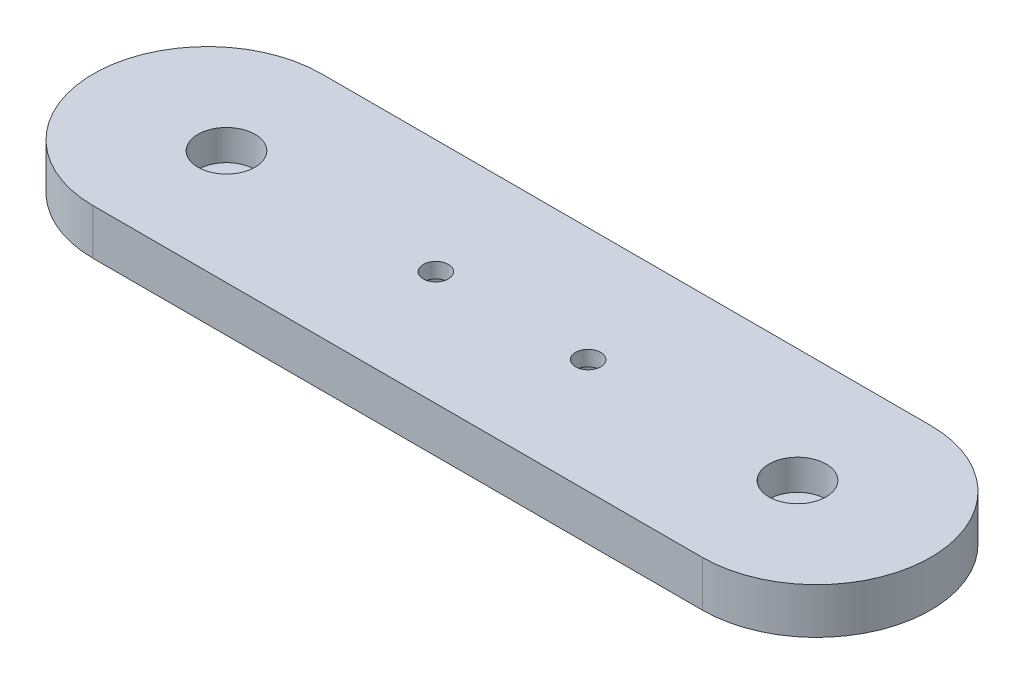
ISO-10303-21;
HEADER;
FILE_DESCRIPTION(('STEP AP214'),'2;1');
FILE_NAME('part.step','',(''),(''),'','','');
FILE_SCHEMA(('AUTOMOTIVE_DESIGN { 1 0 10303 214 1 1 1 1 }'));
ENDSEC;
DATA;
#1=APPLICATION_CONTEXT('core data for automotive mechanical design processes');
#2=APPLICATION_PROTOCOL_DEFINITION('international standard','automotive_design',2000,#1);
#3=PRODUCT_CONTEXT('',#1,'mechanical');
#4=PRODUCT('Part','Part','',(#3));
#5=PRODUCT_RELATED_PRODUCT_CATEGORY('part','',(#4));
#6=PRODUCT_DEFINITION_FORMATION('','',#4);
#7=PRODUCT_DEFINITION_CONTEXT('part definition',#1,'design');
#8=PRODUCT_DEFINITION('design','',#6,#7);
#9=PRODUCT_DEFINITION_SHAPE('','',#8);
#10=(LENGTH_UNIT() NAMED_UNIT(*) SI_UNIT(.MILLI.,.METRE.));
#11=(NAMED_UNIT(*) PLANE_ANGLE_UNIT() SI_UNIT($,.RADIAN.));
#12=(NAMED_UNIT(*) SI_UNIT($,.STERADIAN.) SOLID_ANGLE_UNIT());
#13=UNCERTAINTY_MEASURE_WITH_UNIT(LENGTH_MEASURE(1.E-05),#10,'distance_accuracy_value','');
#14=(GEOMETRIC_REPRESENTATION_CONTEXT(3) GLOBAL_UNCERTAINTY_ASSIGNED_CONTEXT((#13)) GLOBAL_UNIT_ASSIGNED_CONTEXT((#10,
#11,#12)) REPRESENTATION_CONTEXT('',''));
#15=CARTESIAN_POINT('',(0.,0.,0.));
#16=DIRECTION('',(0.,0.,1.));
#17=DIRECTION('',(1.,0.,0.));
#18=AXIS2_PLACEMENT_3D('',#15,#16,#17);
#19=CARTESIAN_POINT('',(10.,6.,0.));
#20=DIRECTION('',(0.,1.,0.));
#21=DIRECTION('',(0.,0.,1.));
#22=AXIS2_PLACEMENT_3D('',#19,#20,#21);
#23=CYLINDRICAL_SURFACE('',#22,1.64999999999999);
#24=CARTESIAN_POINT('',(10.,6.,0.));
#25=DIRECTION('',(0.,1.,0.));
#26=DIRECTION('',(0.,0.,1.));
#27=AXIS2_PLACEMENT_3D('',#24,#25,#26);
#28=CIRCLE('',#27,1.64999999999999);
#29=CARTESIAN_POINT('',(10.,6.,1.64999999999998));
#30=VERTEX_POINT('',#29);
#31=EDGE_CURVE('E114',#30,#30,#28,.T.);
#32=ORIENTED_EDGE('',*,*,#31,.T.);
#33=EDGE_LOOP('',(#32));
#34=FACE_BOUND('',#33,.T.);
#35=CARTESIAN_POINT('',(10.,4.,0.));
#36=DIRECTION('',(0.,-1.,0.));
#37=DIRECTION('',(0.,0.,-1.));
#38=AXIS2_PLACEMENT_3D('',#35,#36,#37);
#39=CIRCLE('',#38,1.64999999999999);
#40=CARTESIAN_POINT('',(10.,4.,-1.65));
#41=VERTEX_POINT('',#40);
#42=EDGE_CURVE('E40',#41,#41,#39,.F.);
#43=ORIENTED_EDGE('',*,*,#42,.F.);
#44=EDGE_LOOP('',(#43));
#45=FACE_BOUND('',#44,.T.);
#46=ADVANCED_FACE('F36',(#34,#45),#23,.F.);
#47=CARTESIAN_POINT('',(-10.,6.,0.));
#48=DIRECTION('',(0.,1.,0.));
#49=DIRECTION('',(0.,0.,1.));
#50=AXIS2_PLACEMENT_3D('',#47,#48,#49);
#51=CYLINDRICAL_SURFACE('',#50,1.64999999999999);
#52=CARTESIAN_POINT('',(-10.,6.,0.));
#53=DIRECTION('',(0.,1.,0.));
#54=DIRECTION('',(0.,0.,1.));
#55=AXIS2_PLACEMENT_3D('',#52,#53,#54);
#56=CIRCLE('',#55,1.64999999999999);
#57=CARTESIAN_POINT('',(-10.,6.,1.64999999999998));
#58=VERTEX_POINT('',#57);
#59=EDGE_CURVE('E121',#58,#58,#56,.T.);
#60=ORIENTED_EDGE('',*,*,#59,.T.);
#61=EDGE_LOOP('',(#60));
#62=FACE_BOUND('',#61,.T.);
#63=CARTESIAN_POINT('',(-10.,4.,0.));
#64=DIRECTION('',(0.,-1.,0.));
#65=DIRECTION('',(0.,0.,-1.));
#66=AXIS2_PLACEMENT_3D('',#63,#64,#65);
#67=CIRCLE('',#66,1.64999999999999);
#68=CARTESIAN_POINT('',(-10.,4.,-1.65));
#69=VERTEX_POINT('',#68);
#70=EDGE_CURVE('E122',#69,#69,#67,.F.);
#71=ORIENTED_EDGE('',*,*,#70,.F.);
#72=EDGE_LOOP('',(#71));
#73=FACE_BOUND('',#72,.T.);
#74=ADVANCED_FACE('F180',(#62,#73),#51,.F.);
#75=CARTESIAN_POINT('',(37.5,6.,0.));
#76=DIRECTION('',(0.,1.,0.));
#77=DIRECTION('',(0.,0.,1.));
#78=AXIS2_PLACEMENT_3D('',#75,#76,#77);
#79=CYLINDRICAL_SURFACE('',#78,1.65);
#80=CARTESIAN_POINT('',(37.5,0.,0.));
#81=DIRECTION('',(0.,-1.,0.));
#82=DIRECTION('',(0.,0.,-1.));
#83=AXIS2_PLACEMENT_3D('',#80,#81,#82);
#84=CIRCLE('',#83,1.65);
#85=CARTESIAN_POINT('',(37.5,0.,-1.65));
#86=VERTEX_POINT('',#85);
#87=EDGE_CURVE('E106',#86,#86,#84,.T.);
#88=ORIENTED_EDGE('',*,*,#87,.T.);
#89=EDGE_LOOP('',(#88));
#90=FACE_BOUND('',#89,.T.);
#91=CARTESIAN_POINT('',(37.5,2.,0.));
#92=DIRECTION('',(0.,1.,0.));
#93=DIRECTION('',(0.,0.,1.));
#94=AXIS2_PLACEMENT_3D('',#91,#92,#93);
#95=CIRCLE('',#94,1.65);
#96=CARTESIAN_POINT('',(37.5,2.,1.65));
#97=VERTEX_POINT('',#96);
#98=EDGE_CURVE('E118',#97,#97,#95,.F.);
#99=ORIENTED_EDGE('',*,*,#98,.F.);
#100=EDGE_LOOP('',(#99));
#101=FACE_BOUND('',#100,.T.);
#102=ADVANCED_FACE('F185',(#90,#101),#79,.F.);
#103=CARTESIAN_POINT('',(-37.5,6.,0.));
#104=DIRECTION('',(0.,1.,0.));
#105=DIRECTION('',(0.,0.,1.));
#106=AXIS2_PLACEMENT_3D('',#103,#104,#105);
#107=CYLINDRICAL_SURFACE('',#106,1.65);
#108=CARTESIAN_POINT('',(-37.5,0.,0.));
#109=DIRECTION('',(0.,-1.,0.));
#110=DIRECTION('',(0.,0.,-1.));
#111=AXIS2_PLACEMENT_3D('',#108,#109,#110);
#112=CIRCLE('',#111,1.65);
#113=CARTESIAN_POINT('',(-37.5,0.,-1.65));
#114=VERTEX_POINT('',#113);
#115=EDGE_CURVE('E155',#114,#114,#112,.T.);
#116=ORIENTED_EDGE('',*,*,#115,.T.);
#117=EDGE_LOOP('',(#116));
#118=FACE_BOUND('',#117,.T.);
#119=CARTESIAN_POINT('',(-37.5,2.,0.));
#120=DIRECTION('',(0.,1.,0.));
#121=DIRECTION('',(0.,0.,1.));
#122=AXIS2_PLACEMENT_3D('',#119,#120,#121);
#123=CIRCLE('',#122,1.65);
#124=CARTESIAN_POINT('',(-37.5,2.,1.65));
#125=VERTEX_POINT('',#124);
#126=EDGE_CURVE('E115',#125,#125,#123,.F.);
#127=ORIENTED_EDGE('',*,*,#126,.F.);
#128=EDGE_LOOP('',(#127));
#129=FACE_BOUND('',#128,.T.);
#130=ADVANCED_FACE('F189',(#118,#129),#107,.F.);
#131=CARTESIAN_POINT('',(40.,6.,0.));
#132=DIRECTION('',(0.,-1.,0.));
#133=DIRECTION('',(0.,0.,-1.));
#134=AXIS2_PLACEMENT_3D('',#131,#132,#133);
#135=CYLINDRICAL_SURFACE('',#134,15.);
#136=CARTESIAN_POINT('',(40.,0.,0.));
#137=DIRECTION('',(0.,1.,0.));
#138=DIRECTION('',(0.,0.,-1.));
#139=AXIS2_PLACEMENT_3D('',#136,#137,#138);
#140=CIRCLE('',#139,15.);
#141=CARTESIAN_POINT('',(40.,0.,15.));
#142=VERTEX_POINT('',#141);
#143=CARTESIAN_POINT('',(40.,0.,-15.));
#144=VERTEX_POINT('',#143);
#145=EDGE_CURVE('E103',#142,#144,#140,.T.);
#146=ORIENTED_EDGE('',*,*,#145,.T.);
#147=DIRECTION('',(0.,-1.,0.));
#148=VECTOR('',#147,1.);
#149=CARTESIAN_POINT('',(40.,6.,-15.));
#150=LINE('',#149,#148);
#151=CARTESIAN_POINT('',(40.,6.,-15.));
#152=VERTEX_POINT('',#151);
#153=EDGE_CURVE('E11',#152,#144,#150,.T.);
#154=ORIENTED_EDGE('',*,*,#153,.F.);
#155=CARTESIAN_POINT('',(40.,6.,0.));
#156=DIRECTION('',(0.,1.,0.));
#157=DIRECTION('',(0.,0.,-1.));
#158=AXIS2_PLACEMENT_3D('',#155,#156,#157);
#159=CIRCLE('',#158,15.);
#160=CARTESIAN_POINT('',(40.,6.,15.));
#161=VERTEX_POINT('',#160);
#162=EDGE_CURVE('E90',#161,#152,#159,.T.);
#163=ORIENTED_EDGE('',*,*,#162,.F.);
#164=DIRECTION('',(0.,-1.,0.));
#165=VECTOR('',#164,1.);
#166=CARTESIAN_POINT('',(40.,6.,15.));
#167=LINE('',#166,#165);
#168=EDGE_CURVE('E99',#161,#142,#167,.T.);
#169=ORIENTED_EDGE('',*,*,#168,.T.);
#170=EDGE_LOOP('',(#146,#154,#163,#169));
#171=FACE_BOUND('',#170,.T.);
#172=ADVANCED_FACE('F38',(#171),#135,.T.);
#173=CARTESIAN_POINT('',(-40.,6.,-15.));
#174=DIRECTION('',(0.,0.,1.));
#175=DIRECTION('',(1.,0.,0.));
#176=AXIS2_PLACEMENT_3D('',#173,#174,#175);
#177=PLANE('',#176);
#178=DIRECTION('',(-1.,0.,0.));
#179=VECTOR('',#178,1.);
#180=CARTESIAN_POINT('',(-40.,0.,-15.));
#181=LINE('',#180,#179);
#182=CARTESIAN_POINT('',(-40.,0.,-15.));
#183=VERTEX_POINT('',#182);
#184=EDGE_CURVE('E94',#144,#183,#181,.T.);
#185=ORIENTED_EDGE('',*,*,#184,.T.);
#186=DIRECTION('',(0.,-1.,0.));
#187=VECTOR('',#186,1.);
#188=CARTESIAN_POINT('',(-40.,6.,-15.));
#189=LINE('',#188,#187);
#190=CARTESIAN_POINT('',(-40.,6.,-15.));
#191=VERTEX_POINT('',#190);
#192=EDGE_CURVE('E46',#191,#183,#189,.T.);
#193=ORIENTED_EDGE('',*,*,#192,.F.);
#194=DIRECTION('',(-1.,0.,0.));
#195=VECTOR('',#194,1.);
#196=CARTESIAN_POINT('',(-40.,6.,-15.));
#197=LINE('',#196,#195);
#198=EDGE_CURVE('E85',#152,#191,#197,.T.);
#199=ORIENTED_EDGE('',*,*,#198,.F.);
#200=ORIENTED_EDGE('',*,*,#153,.T.);
#201=EDGE_LOOP('',(#185,#193,#199,#200));
#202=FACE_BOUND('',#201,.T.);
#203=ADVANCED_FACE('F93',(#202),#177,.F.);
#204=CARTESIAN_POINT('',(-40.,6.,0.));
#205=DIRECTION('',(0.,-1.,0.));
#206=DIRECTION('',(0.,0.,-1.));
#207=AXIS2_PLACEMENT_3D('',#204,#205,#206);
#208=CYLINDRICAL_SURFACE('',#207,15.);
#209=CARTESIAN_POINT('',(-40.,0.,0.));
#210=DIRECTION('',(0.,1.,0.));
#211=DIRECTION('',(0.,0.,-1.));
#212=AXIS2_PLACEMENT_3D('',#209,#210,#211);
#213=CIRCLE('',#212,15.);
#214=CARTESIAN_POINT('',(-40.,0.,15.));
#215=VERTEX_POINT('',#214);
#216=EDGE_CURVE('E72',#183,#215,#213,.T.);
#217=ORIENTED_EDGE('',*,*,#216,.T.);
#218=DIRECTION('',(0.,-1.,0.));
#219=VECTOR('',#218,1.);
#220=CARTESIAN_POINT('',(-40.,6.,15.));
#221=LINE('',#220,#219);
#222=CARTESIAN_POINT('',(-40.,6.,15.));
#223=VERTEX_POINT('',#222);
#224=EDGE_CURVE('E95',#223,#215,#221,.T.);
#225=ORIENTED_EDGE('',*,*,#224,.F.);
#226=CARTESIAN_POINT('',(-40.,6.,0.));
#227=DIRECTION('',(0.,1.,0.));
#228=DIRECTION('',(0.,0.,-1.));
#229=AXIS2_PLACEMENT_3D('',#226,#227,#228);
#230=CIRCLE('',#229,15.);
#231=EDGE_CURVE('E88',#191,#223,#230,.T.);
#232=ORIENTED_EDGE('',*,*,#231,.F.);
#233=ORIENTED_EDGE('',*,*,#192,.T.);
#234=EDGE_LOOP('',(#217,#225,#232,#233));
#235=FACE_BOUND('',#234,.T.);
#236=ADVANCED_FACE('F97',(#235),#208,.T.);
#237=CARTESIAN_POINT('',(-40.,6.,15.));
#238=DIRECTION('',(0.,0.,-1.));
#239=DIRECTION('',(-1.,0.,0.));
#240=AXIS2_PLACEMENT_3D('',#237,#238,#239);
#241=PLANE('',#240);
#242=DIRECTION('',(1.,0.,0.));
#243=VECTOR('',#242,1.);
#244=CARTESIAN_POINT('',(-40.,0.,15.));
#245=LINE('',#244,#243);
#246=EDGE_CURVE('E78',#215,#142,#245,.T.);
#247=ORIENTED_EDGE('',*,*,#246,.T.);
#248=ORIENTED_EDGE('',*,*,#168,.F.);
#249=DIRECTION('',(1.,0.,0.));
#250=VECTOR('',#249,1.);
#251=CARTESIAN_POINT('',(-40.,6.,15.));
#252=LINE('',#251,#250);
#253=EDGE_CURVE('E55',#223,#161,#252,.T.);
#254=ORIENTED_EDGE('',*,*,#253,.F.);
#255=ORIENTED_EDGE('',*,*,#224,.T.);
#256=EDGE_LOOP('',(#247,#248,#254,#255));
#257=FACE_BOUND('',#256,.T.);
#258=ADVANCED_FACE('F165',(#257),#241,.F.);
#259=CARTESIAN_POINT('',(40.,6.,0.));
#260=DIRECTION('',(0.,-1.,0.));
#261=DIRECTION('',(0.,0.,-1.));
#262=AXIS2_PLACEMENT_3D('',#259,#260,#261);
#263=PLANE('',#262);
#264=CARTESIAN_POINT('',(37.5,6.,0.));
#265=DIRECTION('',(0.,1.,0.));
#266=DIRECTION('',(0.,0.,1.));
#267=AXIS2_PLACEMENT_3D('',#264,#265,#266);
#268=CIRCLE('',#267,3.75000000000001);
#269=CARTESIAN_POINT('',(37.5,6.,3.75000000000001));
#270=VERTEX_POINT('',#269);
#271=EDGE_CURVE('E145',#270,#270,#268,.T.);
#272=ORIENTED_EDGE('',*,*,#271,.F.);
#273=EDGE_LOOP('',(#272));
#274=FACE_BOUND('',#273,.T.);
#275=CARTESIAN_POINT('',(-37.5,6.,5.2372220082647E-13));
#276=DIRECTION('',(0.,1.,0.));
#277=DIRECTION('',(0.,0.,1.));
#278=AXIS2_PLACEMENT_3D('',#275,#276,#277);
#279=CIRCLE('',#278,3.75000000000001);
#280=CARTESIAN_POINT('',(-37.5,6.,3.75000000000053));
#281=VERTEX_POINT('',#280);
#282=EDGE_CURVE('E128',#281,#281,#279,.T.);
#283=ORIENTED_EDGE('',*,*,#282,.F.);
#284=EDGE_LOOP('',(#283));
#285=FACE_BOUND('',#284,.T.);
#286=ORIENTED_EDGE('',*,*,#59,.F.);
#287=EDGE_LOOP('',(#286));
#288=FACE_BOUND('',#287,.T.);
#289=ORIENTED_EDGE('',*,*,#31,.F.);
#290=EDGE_LOOP('',(#289));
#291=FACE_BOUND('',#290,.T.);
#292=ORIENTED_EDGE('',*,*,#162,.T.);
#293=ORIENTED_EDGE('',*,*,#198,.T.);
#294=ORIENTED_EDGE('',*,*,#231,.T.);
#295=ORIENTED_EDGE('',*,*,#253,.T.);
#296=EDGE_LOOP('',(#292,#293,#294,#295));
#297=FACE_BOUND('',#296,.T.);
#298=ADVANCED_FACE('F86',(#274,#285,#288,#291,#297),#263,.F.);
#299=CARTESIAN_POINT('',(40.,0.,0.));
#300=DIRECTION('',(0.,-1.,0.));
#301=DIRECTION('',(0.,0.,-1.));
#302=AXIS2_PLACEMENT_3D('',#299,#300,#301);
#303=PLANE('',#302);
#304=CARTESIAN_POINT('',(-10.,0.,0.));
#305=DIRECTION('',(0.,-1.,0.));
#306=DIRECTION('',(0.,0.,-1.));
#307=AXIS2_PLACEMENT_3D('',#304,#305,#306);
#308=CIRCLE('',#307,3.75);
#309=CARTESIAN_POINT('',(-10.,0.,-3.75));
#310=VERTEX_POINT('',#309);
#311=EDGE_CURVE('E130',#310,#310,#308,.T.);
#312=ORIENTED_EDGE('',*,*,#311,.F.);
#313=EDGE_LOOP('',(#312));
#314=FACE_BOUND('',#313,.T.);
#315=CARTESIAN_POINT('',(10.,0.,0.));
#316=DIRECTION('',(0.,-1.,0.));
#317=DIRECTION('',(0.,0.,-1.));
#318=AXIS2_PLACEMENT_3D('',#315,#316,#317);
#319=CIRCLE('',#318,3.75);
#320=CARTESIAN_POINT('',(10.,0.,-3.75));
#321=VERTEX_POINT('',#320);
#322=EDGE_CURVE('E140',#321,#321,#319,.T.);
#323=ORIENTED_EDGE('',*,*,#322,.F.);
#324=EDGE_LOOP('',(#323));
#325=FACE_BOUND('',#324,.T.);
#326=ORIENTED_EDGE('',*,*,#115,.F.);
#327=EDGE_LOOP('',(#326));
#328=FACE_BOUND('',#327,.T.);
#329=ORIENTED_EDGE('',*,*,#87,.F.);
#330=EDGE_LOOP('',(#329));
#331=FACE_BOUND('',#330,.T.);
#332=ORIENTED_EDGE('',*,*,#145,.F.);
#333=ORIENTED_EDGE('',*,*,#246,.F.);
#334=ORIENTED_EDGE('',*,*,#216,.F.);
#335=ORIENTED_EDGE('',*,*,#184,.F.);
#336=EDGE_LOOP('',(#332,#333,#334,#335));
#337=FACE_BOUND('',#336,.T.);
#338=ADVANCED_FACE('F164',(#314,#325,#328,#331,#337),#303,.T.);
#339=CARTESIAN_POINT('',(-37.5,2.,5.2372220082647E-13));
#340=DIRECTION('',(0.,1.,0.));
#341=DIRECTION('',(0.,0.,1.));
#342=AXIS2_PLACEMENT_3D('',#339,#340,#341);
#343=PLANE('',#342);
#344=CARTESIAN_POINT('',(-37.5,2.,5.2372220082647E-13));
#345=DIRECTION('',(0.,1.,0.));
#346=DIRECTION('',(0.,0.,1.));
#347=AXIS2_PLACEMENT_3D('',#344,#345,#346);
#348=CIRCLE('',#347,3.75000000000001);
#349=CARTESIAN_POINT('',(-37.5,2.,3.75000000000053));
#350=VERTEX_POINT('',#349);
#351=EDGE_CURVE('E148',#350,#350,#348,.T.);
#352=ORIENTED_EDGE('',*,*,#351,.T.);
#353=EDGE_LOOP('',(#352));
#354=FACE_BOUND('',#353,.T.);
#355=ORIENTED_EDGE('',*,*,#126,.T.);
#356=EDGE_LOOP('',(#355));
#357=FACE_BOUND('',#356,.T.);
#358=ADVANCED_FACE('F172',(#354,#357),#343,.T.);
#359=CARTESIAN_POINT('',(-37.5,2.,5.2372220082647E-13));
#360=DIRECTION('',(0.,1.,0.));
#361=DIRECTION('',(0.,0.,1.));
#362=AXIS2_PLACEMENT_3D('',#359,#360,#361);
#363=CYLINDRICAL_SURFACE('',#362,3.75000000000001);
#364=ORIENTED_EDGE('',*,*,#351,.F.);
#365=EDGE_LOOP('',(#364));
#366=FACE_BOUND('',#365,.T.);
#367=ORIENTED_EDGE('',*,*,#282,.T.);
#368=EDGE_LOOP('',(#367));
#369=FACE_BOUND('',#368,.T.);
#370=ADVANCED_FACE('F203',(#366,#369),#363,.F.);
#371=CARTESIAN_POINT('',(37.5,2.,0.));
#372=DIRECTION('',(0.,1.,0.));
#373=DIRECTION('',(0.,0.,1.));
#374=AXIS2_PLACEMENT_3D('',#371,#372,#373);
#375=PLANE('',#374);
#376=CARTESIAN_POINT('',(37.5,2.,0.));
#377=DIRECTION('',(0.,1.,0.));
#378=DIRECTION('',(0.,0.,1.));
#379=AXIS2_PLACEMENT_3D('',#376,#377,#378);
#380=CIRCLE('',#379,3.75000000000001);
#381=CARTESIAN_POINT('',(37.5,2.,3.75000000000001));
#382=VERTEX_POINT('',#381);
#383=EDGE_CURVE('E119',#382,#382,#380,.T.);
#384=ORIENTED_EDGE('',*,*,#383,.T.);
#385=EDGE_LOOP('',(#384));
#386=FACE_BOUND('',#385,.T.);
#387=ORIENTED_EDGE('',*,*,#98,.T.);
#388=EDGE_LOOP('',(#387));
#389=FACE_BOUND('',#388,.T.);
#390=ADVANCED_FACE('F200',(#386,#389),#375,.T.);
#391=CARTESIAN_POINT('',(37.5,2.,0.));
#392=DIRECTION('',(0.,1.,0.));
#393=DIRECTION('',(0.,0.,1.));
#394=AXIS2_PLACEMENT_3D('',#391,#392,#393);
#395=CYLINDRICAL_SURFACE('',#394,3.75000000000001);
#396=ORIENTED_EDGE('',*,*,#383,.F.);
#397=EDGE_LOOP('',(#396));
#398=FACE_BOUND('',#397,.T.);
#399=ORIENTED_EDGE('',*,*,#271,.T.);
#400=EDGE_LOOP('',(#399));
#401=FACE_BOUND('',#400,.T.);
#402=ADVANCED_FACE('F202',(#398,#401),#395,.F.);
#403=CARTESIAN_POINT('',(-10.,4.,0.));
#404=DIRECTION('',(0.,-1.,0.));
#405=DIRECTION('',(0.,0.,-1.));
#406=AXIS2_PLACEMENT_3D('',#403,#404,#405);
#407=PLANE('',#406);
#408=CARTESIAN_POINT('',(-10.,4.,0.));
#409=DIRECTION('',(0.,-1.,0.));
#410=DIRECTION('',(0.,0.,-1.));
#411=AXIS2_PLACEMENT_3D('',#408,#409,#410);
#412=CIRCLE('',#411,3.75);
#413=CARTESIAN_POINT('',(-10.,4.,-3.75));
#414=VERTEX_POINT('',#413);
#415=EDGE_CURVE('E124',#414,#414,#412,.T.);
#416=ORIENTED_EDGE('',*,*,#415,.T.);
#417=EDGE_LOOP('',(#416));
#418=FACE_BOUND('',#417,.T.);
#419=ORIENTED_EDGE('',*,*,#70,.T.);
#420=EDGE_LOOP('',(#419));
#421=FACE_BOUND('',#420,.T.);
#422=ADVANCED_FACE('F210',(#418,#421),#407,.T.);
#423=CARTESIAN_POINT('',(-10.,4.,0.));
#424=DIRECTION('',(0.,-1.,0.));
#425=DIRECTION('',(0.,0.,-1.));
#426=AXIS2_PLACEMENT_3D('',#423,#424,#425);
#427=CYLINDRICAL_SURFACE('',#426,3.75);
#428=ORIENTED_EDGE('',*,*,#415,.F.);
#429=EDGE_LOOP('',(#428));
#430=FACE_BOUND('',#429,.T.);
#431=ORIENTED_EDGE('',*,*,#311,.T.);
#432=EDGE_LOOP('',(#431));
#433=FACE_BOUND('',#432,.T.);
#434=ADVANCED_FACE('F273',(#430,#433),#427,.F.);
#435=CARTESIAN_POINT('',(10.,4.,0.));
#436=DIRECTION('',(0.,-1.,0.));
#437=DIRECTION('',(0.,0.,-1.));
#438=AXIS2_PLACEMENT_3D('',#435,#436,#437);
#439=PLANE('',#438);
#440=CARTESIAN_POINT('',(10.,4.,0.));
#441=DIRECTION('',(0.,-1.,0.));
#442=DIRECTION('',(0.,0.,-1.));
#443=AXIS2_PLACEMENT_3D('',#440,#441,#442);
#444=CIRCLE('',#443,3.75);
#445=CARTESIAN_POINT('',(10.,4.,-3.75));
#446=VERTEX_POINT('',#445);
#447=EDGE_CURVE('E135',#446,#446,#444,.T.);
#448=ORIENTED_EDGE('',*,*,#447,.T.);
#449=EDGE_LOOP('',(#448));
#450=FACE_BOUND('',#449,.T.);
#451=ORIENTED_EDGE('',*,*,#42,.T.);
#452=EDGE_LOOP('',(#451));
#453=FACE_BOUND('',#452,.T.);
#454=ADVANCED_FACE('F282',(#450,#453),#439,.T.);
#455=CARTESIAN_POINT('',(10.,4.,0.));
#456=DIRECTION('',(0.,-1.,0.));
#457=DIRECTION('',(0.,0.,-1.));
#458=AXIS2_PLACEMENT_3D('',#455,#456,#457);
#459=CYLINDRICAL_SURFACE('',#458,3.75);
#460=ORIENTED_EDGE('',*,*,#447,.F.);
#461=EDGE_LOOP('',(#460));
#462=FACE_BOUND('',#461,.T.);
#463=ORIENTED_EDGE('',*,*,#322,.T.);
#464=EDGE_LOOP('',(#463));
#465=FACE_BOUND('',#464,.T.);
#466=ADVANCED_FACE('F216',(#462,#465),#459,.F.);
#467=CLOSED_SHELL('',(#46,#74,#102,#130,#172,#203,#236,#258,#298,#338,#358,#370,#390,#402,#422,
#434,#454,#466));
#468=MANIFOLD_SOLID_BREP('B2',#467);
#469=ADVANCED_BREP_SHAPE_REPRESENTATION('',(#18,#468),#14);
#470=SHAPE_DEFINITION_REPRESENTATION(#9,#469);
ENDSEC;
END-ISO-10303-21;
